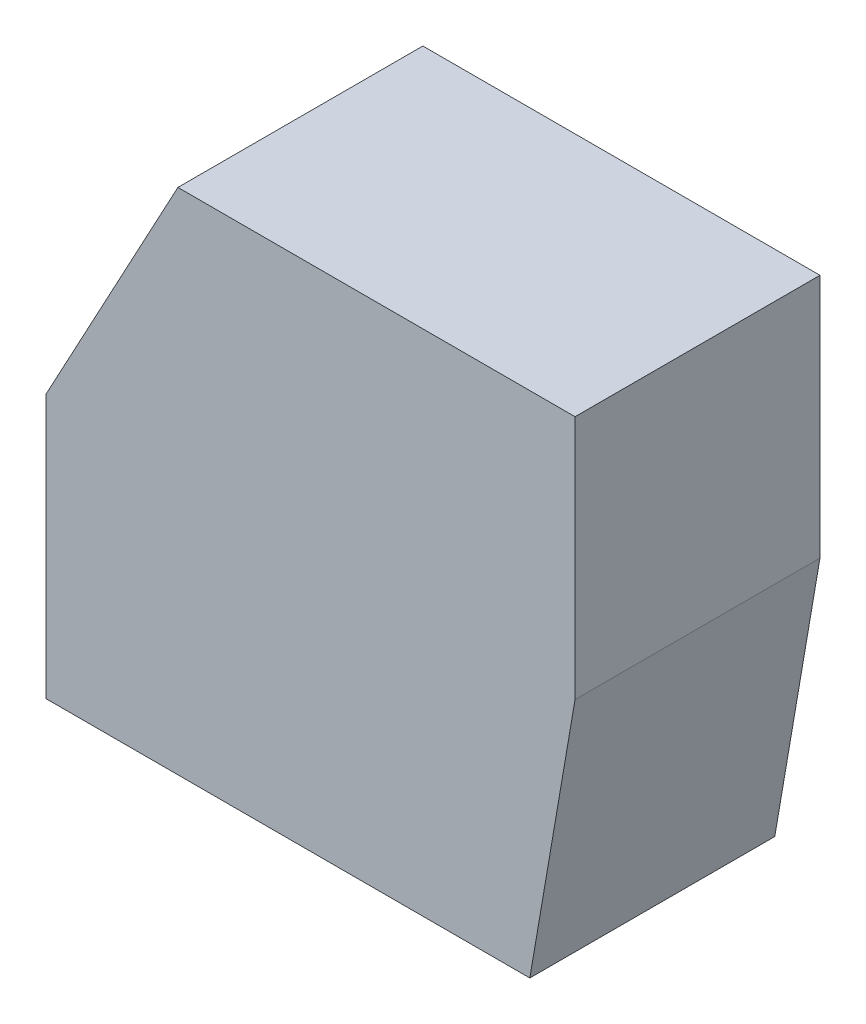
ISO-10303-21;
HEADER;
FILE_DESCRIPTION(('STEP AP214'),'2;1');
FILE_NAME('part.step','',(''),(''),'','','');
FILE_SCHEMA(('AUTOMOTIVE_DESIGN { 1 0 10303 214 1 1 1 1 }'));
ENDSEC;
DATA;
#1=APPLICATION_CONTEXT('core data for automotive mechanical design processes');
#2=APPLICATION_PROTOCOL_DEFINITION('international standard','automotive_design',2000,#1);
#3=PRODUCT_CONTEXT('',#1,'mechanical');
#4=PRODUCT('Part','Part','',(#3));
#5=PRODUCT_RELATED_PRODUCT_CATEGORY('part','',(#4));
#6=PRODUCT_DEFINITION_FORMATION('','',#4);
#7=PRODUCT_DEFINITION_CONTEXT('part definition',#1,'design');
#8=PRODUCT_DEFINITION('design','',#6,#7);
#9=PRODUCT_DEFINITION_SHAPE('','',#8);
#10=(LENGTH_UNIT() NAMED_UNIT(*) SI_UNIT(.MILLI.,.METRE.));
#11=(NAMED_UNIT(*) PLANE_ANGLE_UNIT() SI_UNIT($,.RADIAN.));
#12=(NAMED_UNIT(*) SI_UNIT($,.STERADIAN.) SOLID_ANGLE_UNIT());
#13=UNCERTAINTY_MEASURE_WITH_UNIT(LENGTH_MEASURE(1.E-05),#10,'distance_accuracy_value','');
#14=(GEOMETRIC_REPRESENTATION_CONTEXT(3) GLOBAL_UNCERTAINTY_ASSIGNED_CONTEXT((#13)) GLOBAL_UNIT_ASSIGNED_CONTEXT((#10,
#11,#12)) REPRESENTATION_CONTEXT('',''));
#15=CARTESIAN_POINT('',(0.,0.,0.));
#16=DIRECTION('',(0.,0.,1.));
#17=DIRECTION('',(1.,0.,0.));
#18=AXIS2_PLACEMENT_3D('',#15,#16,#17);
#19=CARTESIAN_POINT('',(-35.,0.,65.));
#20=DIRECTION('',(-1.,0.,0.));
#21=DIRECTION('',(0.,0.,1.));
#22=AXIS2_PLACEMENT_3D('',#19,#20,#21);
#23=PLANE('',#22);
#24=DIRECTION('',(0.,1.,0.));
#25=VECTOR('',#24,1.);
#26=CARTESIAN_POINT('',(-35.,0.,0.));
#27=LINE('',#26,#25);
#28=CARTESIAN_POINT('',(-35.,-35.,0.));
#29=VERTEX_POINT('',#28);
#30=CARTESIAN_POINT('',(-35.,35.,0.));
#31=VERTEX_POINT('',#30);
#32=EDGE_CURVE('E120',#29,#31,#27,.T.);
#33=ORIENTED_EDGE('',*,*,#32,.F.);
#34=DIRECTION('',(0.,0.,-1.));
#35=VECTOR('',#34,1.);
#36=CARTESIAN_POINT('',(-35.,-35.,65.));
#37=LINE('',#36,#35);
#38=CARTESIAN_POINT('',(-35.,-35.,65.));
#39=VERTEX_POINT('',#38);
#40=EDGE_CURVE('E11',#39,#29,#37,.T.);
#41=ORIENTED_EDGE('',*,*,#40,.F.);
#42=DIRECTION('',(0.,1.,0.));
#43=VECTOR('',#42,1.);
#44=CARTESIAN_POINT('',(-35.,0.,65.));
#45=LINE('',#44,#43);
#46=CARTESIAN_POINT('',(-35.,35.,65.));
#47=VERTEX_POINT('',#46);
#48=EDGE_CURVE('E134',#39,#47,#45,.T.);
#49=ORIENTED_EDGE('',*,*,#48,.T.);
#50=DIRECTION('',(0.,0.,-1.));
#51=VECTOR('',#50,1.);
#52=CARTESIAN_POINT('',(-35.,35.,65.));
#53=LINE('',#52,#51);
#54=EDGE_CURVE('E83',#47,#31,#53,.T.);
#55=ORIENTED_EDGE('',*,*,#54,.T.);
#56=EDGE_LOOP('',(#33,#41,#49,#55));
#57=FACE_BOUND('',#56,.T.);
#58=ADVANCED_FACE('F39',(#57),#23,.T.);
#59=CARTESIAN_POINT('',(0.,-35.,65.));
#60=DIRECTION('',(0.,1.,0.));
#61=DIRECTION('',(0.,0.,1.));
#62=AXIS2_PLACEMENT_3D('',#59,#60,#61);
#63=PLANE('',#62);
#64=DIRECTION('',(1.,0.,0.));
#65=VECTOR('',#64,1.);
#66=CARTESIAN_POINT('',(0.,-35.,0.));
#67=LINE('',#66,#65);
#68=CARTESIAN_POINT('',(93.3912088109753,-35.,0.));
#69=VERTEX_POINT('',#68);
#70=EDGE_CURVE('E123',#29,#69,#67,.T.);
#71=ORIENTED_EDGE('',*,*,#70,.T.);
#72=DIRECTION('',(0.,0.,-1.));
#73=VECTOR('',#72,1.);
#74=CARTESIAN_POINT('',(93.3912088109753,-35.,65.));
#75=LINE('',#74,#73);
#76=CARTESIAN_POINT('',(93.3912088109753,-35.,65.));
#77=VERTEX_POINT('',#76);
#78=EDGE_CURVE('E47',#77,#69,#75,.T.);
#79=ORIENTED_EDGE('',*,*,#78,.F.);
#80=DIRECTION('',(1.,0.,0.));
#81=VECTOR('',#80,1.);
#82=CARTESIAN_POINT('',(0.,-35.,65.));
#83=LINE('',#82,#81);
#84=EDGE_CURVE('E147',#39,#77,#83,.T.);
#85=ORIENTED_EDGE('',*,*,#84,.F.);
#86=ORIENTED_EDGE('',*,*,#40,.T.);
#87=EDGE_LOOP('',(#71,#79,#85,#86));
#88=FACE_BOUND('',#87,.T.);
#89=ADVANCED_FACE('F143',(#88),#63,.F.);
#90=CARTESIAN_POINT('',(96.5537119694249,-16.5520649090443,65.));
#91=DIRECTION('',(0.985622254813267,-0.168963815110846,0.));
#92=DIRECTION('',(0.168963815110846,0.985622254813267,0.));
#93=AXIS2_PLACEMENT_3D('',#90,#91,#92);
#94=PLANE('',#93);
#95=DIRECTION('',(-0.168963815110846,-0.985622254813267,0.));
#96=VECTOR('',#95,1.);
#97=CARTESIAN_POINT('',(96.5537119694249,-16.5520649090443,0.));
#98=LINE('',#97,#96);
#99=CARTESIAN_POINT('',(105.391208810975,35.,0.));
#100=VERTEX_POINT('',#99);
#101=EDGE_CURVE('E126',#100,#69,#98,.T.);
#102=ORIENTED_EDGE('',*,*,#101,.F.);
#103=DIRECTION('',(0.,0.,-1.));
#104=VECTOR('',#103,1.);
#105=CARTESIAN_POINT('',(105.391208810975,35.,65.));
#106=LINE('',#105,#104);
#107=CARTESIAN_POINT('',(105.391208810975,35.,65.));
#108=VERTEX_POINT('',#107);
#109=EDGE_CURVE('E113',#108,#100,#106,.T.);
#110=ORIENTED_EDGE('',*,*,#109,.F.);
#111=DIRECTION('',(-0.168963815110846,-0.985622254813267,0.));
#112=VECTOR('',#111,1.);
#113=CARTESIAN_POINT('',(96.5537119694249,-16.5520649090443,65.));
#114=LINE('',#113,#112);
#115=EDGE_CURVE('E102',#108,#77,#114,.T.);
#116=ORIENTED_EDGE('',*,*,#115,.T.);
#117=ORIENTED_EDGE('',*,*,#78,.T.);
#118=EDGE_LOOP('',(#102,#110,#116,#117));
#119=FACE_BOUND('',#118,.T.);
#120=ADVANCED_FACE('F140',(#119),#94,.T.);
#121=CARTESIAN_POINT('',(105.391208810975,0.,65.));
#122=DIRECTION('',(-1.,0.,0.));
#123=DIRECTION('',(0.,0.,1.));
#124=AXIS2_PLACEMENT_3D('',#121,#122,#123);
#125=PLANE('',#124);
#126=DIRECTION('',(0.,1.,0.));
#127=VECTOR('',#126,1.);
#128=CARTESIAN_POINT('',(105.391208810975,0.,0.));
#129=LINE('',#128,#127);
#130=CARTESIAN_POINT('',(105.391208810975,100.,0.));
#131=VERTEX_POINT('',#130);
#132=EDGE_CURVE('E109',#100,#131,#129,.T.);
#133=ORIENTED_EDGE('',*,*,#132,.T.);
#134=DIRECTION('',(0.,0.,-1.));
#135=VECTOR('',#134,1.);
#136=CARTESIAN_POINT('',(105.391208810975,100.,65.));
#137=LINE('',#136,#135);
#138=CARTESIAN_POINT('',(105.391208810975,100.,65.));
#139=VERTEX_POINT('',#138);
#140=EDGE_CURVE('E106',#139,#131,#137,.T.);
#141=ORIENTED_EDGE('',*,*,#140,.F.);
#142=DIRECTION('',(0.,1.,0.));
#143=VECTOR('',#142,1.);
#144=CARTESIAN_POINT('',(105.391208810975,0.,65.));
#145=LINE('',#144,#143);
#146=EDGE_CURVE('E96',#108,#139,#145,.T.);
#147=ORIENTED_EDGE('',*,*,#146,.F.);
#148=ORIENTED_EDGE('',*,*,#109,.T.);
#149=EDGE_LOOP('',(#133,#141,#147,#148));
#150=FACE_BOUND('',#149,.T.);
#151=ADVANCED_FACE('F107',(#150),#125,.F.);
#152=CARTESIAN_POINT('',(0.,100.,65.));
#153=DIRECTION('',(0.,1.,0.));
#154=DIRECTION('',(0.,0.,1.));
#155=AXIS2_PLACEMENT_3D('',#152,#153,#154);
#156=PLANE('',#155);
#157=DIRECTION('',(1.,0.,0.));
#158=VECTOR('',#157,1.);
#159=CARTESIAN_POINT('',(0.,100.,0.));
#160=LINE('',#159,#158);
#161=CARTESIAN_POINT('',(0.,100.,0.));
#162=VERTEX_POINT('',#161);
#163=EDGE_CURVE('E130',#162,#131,#160,.T.);
#164=ORIENTED_EDGE('',*,*,#163,.F.);
#165=DIRECTION('',(0.,0.,-1.));
#166=VECTOR('',#165,1.);
#167=CARTESIAN_POINT('',(0.,100.,65.));
#168=LINE('',#167,#166);
#169=CARTESIAN_POINT('',(0.,100.,65.));
#170=VERTEX_POINT('',#169);
#171=EDGE_CURVE('E76',#170,#162,#168,.T.);
#172=ORIENTED_EDGE('',*,*,#171,.F.);
#173=DIRECTION('',(1.,0.,0.));
#174=VECTOR('',#173,1.);
#175=CARTESIAN_POINT('',(0.,100.,65.));
#176=LINE('',#175,#174);
#177=EDGE_CURVE('E100',#170,#139,#176,.T.);
#178=ORIENTED_EDGE('',*,*,#177,.T.);
#179=ORIENTED_EDGE('',*,*,#140,.T.);
#180=EDGE_LOOP('',(#164,#172,#178,#179));
#181=FACE_BOUND('',#180,.T.);
#182=ADVANCED_FACE('F115',(#181),#156,.T.);
#183=CARTESIAN_POINT('',(-41.7431192660551,22.4770642201835,65.));
#184=DIRECTION('',(0.880471099922175,-0.474099823035018,0.));
#185=DIRECTION('',(0.474099823035018,0.880471099922175,0.));
#186=AXIS2_PLACEMENT_3D('',#183,#184,#185);
#187=PLANE('',#186);
#188=DIRECTION('',(-0.474099823035018,-0.880471099922175,0.));
#189=VECTOR('',#188,1.);
#190=CARTESIAN_POINT('',(-41.7431192660551,22.4770642201835,0.));
#191=LINE('',#190,#189);
#192=EDGE_CURVE('E132',#162,#31,#191,.T.);
#193=ORIENTED_EDGE('',*,*,#192,.T.);
#194=ORIENTED_EDGE('',*,*,#54,.F.);
#195=DIRECTION('',(-0.474099823035018,-0.880471099922175,0.));
#196=VECTOR('',#195,1.);
#197=CARTESIAN_POINT('',(-41.7431192660551,22.4770642201835,65.));
#198=LINE('',#197,#196);
#199=EDGE_CURVE('E55',#170,#47,#198,.T.);
#200=ORIENTED_EDGE('',*,*,#199,.F.);
#201=ORIENTED_EDGE('',*,*,#171,.T.);
#202=EDGE_LOOP('',(#193,#194,#200,#201));
#203=FACE_BOUND('',#202,.T.);
#204=ADVANCED_FACE('F146',(#203),#187,.F.);
#205=CARTESIAN_POINT('',(0.,0.,65.));
#206=DIRECTION('',(0.,0.,1.));
#207=DIRECTION('',(1.,0.,0.));
#208=AXIS2_PLACEMENT_3D('',#205,#206,#207);
#209=PLANE('',#208);
#210=ORIENTED_EDGE('',*,*,#48,.F.);
#211=ORIENTED_EDGE('',*,*,#84,.T.);
#212=ORIENTED_EDGE('',*,*,#115,.F.);
#213=ORIENTED_EDGE('',*,*,#146,.T.);
#214=ORIENTED_EDGE('',*,*,#177,.F.);
#215=ORIENTED_EDGE('',*,*,#199,.T.);
#216=EDGE_LOOP('',(#210,#211,#212,#213,#214,#215));
#217=FACE_BOUND('',#216,.T.);
#218=ADVANCED_FACE('F98',(#217),#209,.T.);
#219=CARTESIAN_POINT('',(0.,0.,0.));
#220=DIRECTION('',(0.,0.,1.));
#221=DIRECTION('',(1.,0.,0.));
#222=AXIS2_PLACEMENT_3D('',#219,#220,#221);
#223=PLANE('',#222);
#224=ORIENTED_EDGE('',*,*,#32,.T.);
#225=ORIENTED_EDGE('',*,*,#192,.F.);
#226=ORIENTED_EDGE('',*,*,#163,.T.);
#227=ORIENTED_EDGE('',*,*,#132,.F.);
#228=ORIENTED_EDGE('',*,*,#101,.T.);
#229=ORIENTED_EDGE('',*,*,#70,.F.);
#230=EDGE_LOOP('',(#224,#225,#226,#227,#228,#229));
#231=FACE_BOUND('',#230,.T.);
#232=ADVANCED_FACE('F145',(#231),#223,.F.);
#233=CLOSED_SHELL('',(#58,#89,#120,#151,#182,#204,#218,#232));
#234=MANIFOLD_SOLID_BREP('B2',#233);
#235=ADVANCED_BREP_SHAPE_REPRESENTATION('',(#18,#234),#14);
#236=SHAPE_DEFINITION_REPRESENTATION(#9,#235);
ENDSEC;
END-ISO-10303-21;
